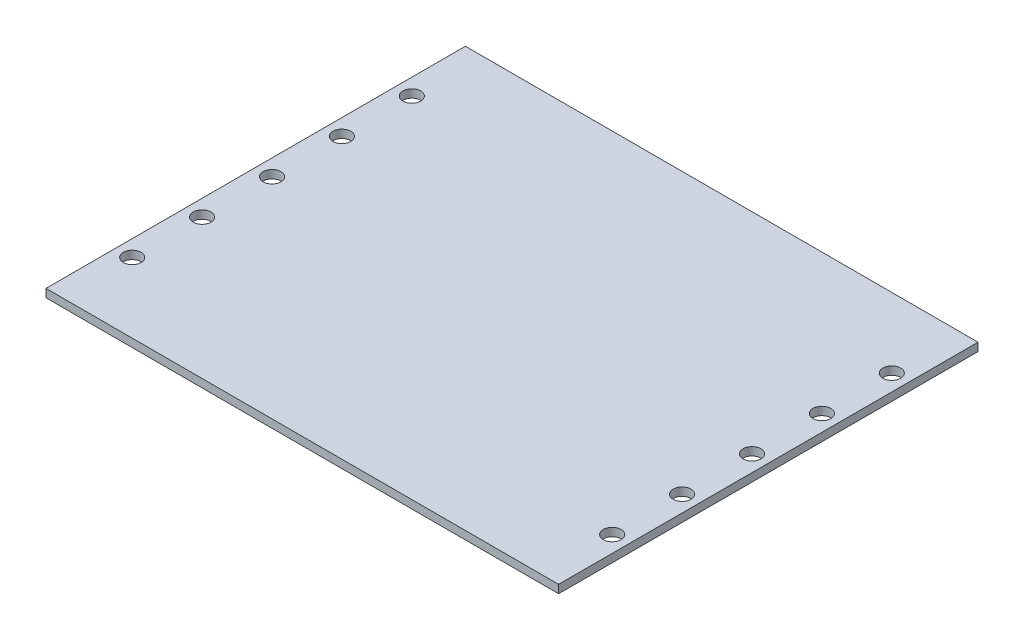
ISO-10303-21;
HEADER;
FILE_DESCRIPTION(('STEP AP214'),'2;1');
FILE_NAME('part.step','',(''),(''),'','','');
FILE_SCHEMA(('AUTOMOTIVE_DESIGN { 1 0 10303 214 1 1 1 1 }'));
ENDSEC;
DATA;
#1=APPLICATION_CONTEXT('core data for automotive mechanical design processes');
#2=APPLICATION_PROTOCOL_DEFINITION('international standard','automotive_design',2000,#1);
#3=PRODUCT_CONTEXT('',#1,'mechanical');
#4=PRODUCT('Part','Part','',(#3));
#5=PRODUCT_RELATED_PRODUCT_CATEGORY('part','',(#4));
#6=PRODUCT_DEFINITION_FORMATION('','',#4);
#7=PRODUCT_DEFINITION_CONTEXT('part definition',#1,'design');
#8=PRODUCT_DEFINITION('design','',#6,#7);
#9=PRODUCT_DEFINITION_SHAPE('','',#8);
#10=(LENGTH_UNIT() NAMED_UNIT(*) SI_UNIT(.MILLI.,.METRE.));
#11=(NAMED_UNIT(*) PLANE_ANGLE_UNIT() SI_UNIT($,.RADIAN.));
#12=(NAMED_UNIT(*) SI_UNIT($,.STERADIAN.) SOLID_ANGLE_UNIT());
#13=UNCERTAINTY_MEASURE_WITH_UNIT(LENGTH_MEASURE(1.E-05),#10,'distance_accuracy_value','');
#14=(GEOMETRIC_REPRESENTATION_CONTEXT(3) GLOBAL_UNCERTAINTY_ASSIGNED_CONTEXT((#13)) GLOBAL_UNIT_ASSIGNED_CONTEXT((#10,
#11,#12)) REPRESENTATION_CONTEXT('',''));
#15=CARTESIAN_POINT('',(0.,0.,0.));
#16=DIRECTION('',(0.,0.,1.));
#17=DIRECTION('',(1.,0.,0.));
#18=AXIS2_PLACEMENT_3D('',#15,#16,#17);
#19=CARTESIAN_POINT('',(0.,1.7526,-90.));
#20=DIRECTION('',(1.,0.,0.));
#21=DIRECTION('',(0.,0.,-1.));
#22=AXIS2_PLACEMENT_3D('',#19,#20,#21);
#23=PLANE('',#22);
#24=DIRECTION('',(0.,0.,1.));
#25=VECTOR('',#24,1.);
#26=CARTESIAN_POINT('',(0.,0.,-90.));
#27=LINE('',#26,#25);
#28=CARTESIAN_POINT('',(0.,0.,-90.));
#29=VERTEX_POINT('',#28);
#30=CARTESIAN_POINT('',(0.,0.,0.));
#31=VERTEX_POINT('',#30);
#32=EDGE_CURVE('E98',#29,#31,#27,.T.);
#33=ORIENTED_EDGE('',*,*,#32,.T.);
#34=DIRECTION('',(0.,-1.,0.));
#35=VECTOR('',#34,1.);
#36=CARTESIAN_POINT('',(0.,1.7526,0.));
#37=LINE('',#36,#35);
#38=CARTESIAN_POINT('',(0.,1.7526,0.));
#39=VERTEX_POINT('',#38);
#40=EDGE_CURVE('E11',#39,#31,#37,.T.);
#41=ORIENTED_EDGE('',*,*,#40,.F.);
#42=DIRECTION('',(0.,0.,1.));
#43=VECTOR('',#42,1.);
#44=CARTESIAN_POINT('',(0.,1.7526,-90.));
#45=LINE('',#44,#43);
#46=CARTESIAN_POINT('',(0.,1.7526,-90.));
#47=VERTEX_POINT('',#46);
#48=EDGE_CURVE('E86',#47,#39,#45,.T.);
#49=ORIENTED_EDGE('',*,*,#48,.F.);
#50=DIRECTION('',(0.,-1.,0.));
#51=VECTOR('',#50,1.);
#52=CARTESIAN_POINT('',(0.,1.7526,-90.));
#53=LINE('',#52,#51);
#54=EDGE_CURVE('E94',#47,#29,#53,.T.);
#55=ORIENTED_EDGE('',*,*,#54,.T.);
#56=EDGE_LOOP('',(#33,#41,#49,#55));
#57=FACE_BOUND('',#56,.T.);
#58=ADVANCED_FACE('F35',(#57),#23,.F.);
#59=CARTESIAN_POINT('',(0.,1.7526,0.));
#60=DIRECTION('',(0.,0.,-1.));
#61=DIRECTION('',(-1.,0.,0.));
#62=AXIS2_PLACEMENT_3D('',#59,#60,#61);
#63=PLANE('',#62);
#64=DIRECTION('',(1.,0.,0.));
#65=VECTOR('',#64,1.);
#66=CARTESIAN_POINT('',(0.,0.,0.));
#67=LINE('',#66,#65);
#68=CARTESIAN_POINT('',(110.,0.,0.));
#69=VERTEX_POINT('',#68);
#70=EDGE_CURVE('E90',#31,#69,#67,.T.);
#71=ORIENTED_EDGE('',*,*,#70,.T.);
#72=DIRECTION('',(0.,-1.,0.));
#73=VECTOR('',#72,1.);
#74=CARTESIAN_POINT('',(110.,1.7526,0.));
#75=LINE('',#74,#73);
#76=CARTESIAN_POINT('',(110.,1.7526,0.));
#77=VERTEX_POINT('',#76);
#78=EDGE_CURVE('E43',#77,#69,#75,.T.);
#79=ORIENTED_EDGE('',*,*,#78,.F.);
#80=DIRECTION('',(1.,0.,0.));
#81=VECTOR('',#80,1.);
#82=CARTESIAN_POINT('',(0.,1.7526,0.));
#83=LINE('',#82,#81);
#84=EDGE_CURVE('E81',#39,#77,#83,.T.);
#85=ORIENTED_EDGE('',*,*,#84,.F.);
#86=ORIENTED_EDGE('',*,*,#40,.T.);
#87=EDGE_LOOP('',(#71,#79,#85,#86));
#88=FACE_BOUND('',#87,.T.);
#89=ADVANCED_FACE('F89',(#88),#63,.F.);
#90=CARTESIAN_POINT('',(110.,1.7526,0.));
#91=DIRECTION('',(-1.,0.,0.));
#92=DIRECTION('',(0.,0.,1.));
#93=AXIS2_PLACEMENT_3D('',#90,#91,#92);
#94=PLANE('',#93);
#95=DIRECTION('',(0.,0.,-1.));
#96=VECTOR('',#95,1.);
#97=CARTESIAN_POINT('',(110.,0.,0.));
#98=LINE('',#97,#96);
#99=CARTESIAN_POINT('',(110.,0.,-90.));
#100=VERTEX_POINT('',#99);
#101=EDGE_CURVE('E68',#69,#100,#98,.T.);
#102=ORIENTED_EDGE('',*,*,#101,.T.);
#103=DIRECTION('',(0.,-1.,0.));
#104=VECTOR('',#103,1.);
#105=CARTESIAN_POINT('',(110.,1.7526,-90.));
#106=LINE('',#105,#104);
#107=CARTESIAN_POINT('',(110.,1.7526,-90.));
#108=VERTEX_POINT('',#107);
#109=EDGE_CURVE('E91',#108,#100,#106,.T.);
#110=ORIENTED_EDGE('',*,*,#109,.F.);
#111=DIRECTION('',(0.,0.,-1.));
#112=VECTOR('',#111,1.);
#113=CARTESIAN_POINT('',(110.,1.7526,0.));
#114=LINE('',#113,#112);
#115=EDGE_CURVE('E84',#77,#108,#114,.T.);
#116=ORIENTED_EDGE('',*,*,#115,.F.);
#117=ORIENTED_EDGE('',*,*,#78,.T.);
#118=EDGE_LOOP('',(#102,#110,#116,#117));
#119=FACE_BOUND('',#118,.T.);
#120=ADVANCED_FACE('F92',(#119),#94,.F.);
#121=CARTESIAN_POINT('',(110.,1.7526,-90.));
#122=DIRECTION('',(0.,0.,1.));
#123=DIRECTION('',(1.,0.,0.));
#124=AXIS2_PLACEMENT_3D('',#121,#122,#123);
#125=PLANE('',#124);
#126=DIRECTION('',(-1.,0.,0.));
#127=VECTOR('',#126,1.);
#128=CARTESIAN_POINT('',(110.,0.,-90.));
#129=LINE('',#128,#127);
#130=EDGE_CURVE('E74',#100,#29,#129,.T.);
#131=ORIENTED_EDGE('',*,*,#130,.T.);
#132=ORIENTED_EDGE('',*,*,#54,.F.);
#133=DIRECTION('',(-1.,0.,0.));
#134=VECTOR('',#133,1.);
#135=CARTESIAN_POINT('',(110.,1.7526,-90.));
#136=LINE('',#135,#134);
#137=EDGE_CURVE('E51',#108,#47,#136,.T.);
#138=ORIENTED_EDGE('',*,*,#137,.F.);
#139=ORIENTED_EDGE('',*,*,#109,.T.);
#140=EDGE_LOOP('',(#131,#132,#138,#139));
#141=FACE_BOUND('',#140,.T.);
#142=ADVANCED_FACE('F106',(#141),#125,.F.);
#143=CARTESIAN_POINT('',(0.,1.7526,0.));
#144=DIRECTION('',(0.,1.,0.));
#145=DIRECTION('',(0.,0.,1.));
#146=AXIS2_PLACEMENT_3D('',#143,#144,#145);
#147=PLANE('',#146);
#148=CARTESIAN_POINT('',(3.49999999999979,1.7526,-75.));
#149=DIRECTION('',(0.,1.,0.));
#150=DIRECTION('',(0.,0.,1.));
#151=AXIS2_PLACEMENT_3D('',#148,#149,#150);
#152=CIRCLE('',#151,1.905);
#153=CARTESIAN_POINT('',(3.49999999999979,1.7526,-73.095));
#154=VERTEX_POINT('',#153);
#155=EDGE_CURVE('E166',#154,#154,#152,.T.);
#156=ORIENTED_EDGE('',*,*,#155,.F.);
#157=EDGE_LOOP('',(#156));
#158=FACE_BOUND('',#157,.T.);
#159=CARTESIAN_POINT('',(3.49999999999984,1.7526,-60.));
#160=DIRECTION('',(0.,1.,0.));
#161=DIRECTION('',(0.,0.,1.));
#162=AXIS2_PLACEMENT_3D('',#159,#160,#161);
#163=CIRCLE('',#162,1.905);
#164=CARTESIAN_POINT('',(3.49999999999984,1.7526,-58.095));
#165=VERTEX_POINT('',#164);
#166=EDGE_CURVE('E160',#165,#165,#163,.T.);
#167=ORIENTED_EDGE('',*,*,#166,.F.);
#168=EDGE_LOOP('',(#167));
#169=FACE_BOUND('',#168,.T.);
#170=CARTESIAN_POINT('',(3.4999999999999,1.7526,-45.));
#171=DIRECTION('',(0.,1.,0.));
#172=DIRECTION('',(0.,0.,1.));
#173=AXIS2_PLACEMENT_3D('',#170,#171,#172);
#174=CIRCLE('',#173,1.905);
#175=CARTESIAN_POINT('',(3.4999999999999,1.7526,-43.095));
#176=VERTEX_POINT('',#175);
#177=EDGE_CURVE('E154',#176,#176,#174,.T.);
#178=ORIENTED_EDGE('',*,*,#177,.F.);
#179=EDGE_LOOP('',(#178));
#180=FACE_BOUND('',#179,.T.);
#181=CARTESIAN_POINT('',(3.49999999999995,1.7526,-30.));
#182=DIRECTION('',(0.,1.,0.));
#183=DIRECTION('',(0.,0.,1.));
#184=AXIS2_PLACEMENT_3D('',#181,#182,#183);
#185=CIRCLE('',#184,1.905);
#186=CARTESIAN_POINT('',(3.49999999999995,1.7526,-28.095));
#187=VERTEX_POINT('',#186);
#188=EDGE_CURVE('E148',#187,#187,#185,.T.);
#189=ORIENTED_EDGE('',*,*,#188,.F.);
#190=EDGE_LOOP('',(#189));
#191=FACE_BOUND('',#190,.T.);
#192=CARTESIAN_POINT('',(106.5,1.7526,-75.));
#193=DIRECTION('',(0.,1.,0.));
#194=DIRECTION('',(0.,0.,1.));
#195=AXIS2_PLACEMENT_3D('',#192,#193,#194);
#196=CIRCLE('',#195,1.905);
#197=CARTESIAN_POINT('',(106.5,1.7526,-73.095));
#198=VERTEX_POINT('',#197);
#199=EDGE_CURVE('E142',#198,#198,#196,.T.);
#200=ORIENTED_EDGE('',*,*,#199,.F.);
#201=EDGE_LOOP('',(#200));
#202=FACE_BOUND('',#201,.T.);
#203=CARTESIAN_POINT('',(106.5,1.7526,-60.));
#204=DIRECTION('',(0.,1.,0.));
#205=DIRECTION('',(0.,0.,1.));
#206=AXIS2_PLACEMENT_3D('',#203,#204,#205);
#207=CIRCLE('',#206,1.90499999999999);
#208=CARTESIAN_POINT('',(106.5,1.7526,-58.095));
#209=VERTEX_POINT('',#208);
#210=EDGE_CURVE('E136',#209,#209,#207,.T.);
#211=ORIENTED_EDGE('',*,*,#210,.F.);
#212=EDGE_LOOP('',(#211));
#213=FACE_BOUND('',#212,.T.);
#214=CARTESIAN_POINT('',(106.5,1.7526,-45.));
#215=DIRECTION('',(0.,1.,0.));
#216=DIRECTION('',(0.,0.,1.));
#217=AXIS2_PLACEMENT_3D('',#214,#215,#216);
#218=CIRCLE('',#217,1.90499999999999);
#219=CARTESIAN_POINT('',(106.5,1.7526,-43.095));
#220=VERTEX_POINT('',#219);
#221=EDGE_CURVE('E130',#220,#220,#218,.T.);
#222=ORIENTED_EDGE('',*,*,#221,.F.);
#223=EDGE_LOOP('',(#222));
#224=FACE_BOUND('',#223,.T.);
#225=CARTESIAN_POINT('',(106.5,1.7526,-30.));
#226=DIRECTION('',(0.,1.,0.));
#227=DIRECTION('',(0.,0.,1.));
#228=AXIS2_PLACEMENT_3D('',#225,#226,#227);
#229=CIRCLE('',#228,1.90499999999999);
#230=CARTESIAN_POINT('',(106.5,1.7526,-28.095));
#231=VERTEX_POINT('',#230);
#232=EDGE_CURVE('E124',#231,#231,#229,.T.);
#233=ORIENTED_EDGE('',*,*,#232,.F.);
#234=EDGE_LOOP('',(#233));
#235=FACE_BOUND('',#234,.T.);
#236=CARTESIAN_POINT('',(106.5,1.7526,-15.));
#237=DIRECTION('',(0.,1.,0.));
#238=DIRECTION('',(0.,0.,1.));
#239=AXIS2_PLACEMENT_3D('',#236,#237,#238);
#240=CIRCLE('',#239,1.90499999999999);
#241=CARTESIAN_POINT('',(106.5,1.7526,-13.095));
#242=VERTEX_POINT('',#241);
#243=EDGE_CURVE('E118',#242,#242,#240,.T.);
#244=ORIENTED_EDGE('',*,*,#243,.F.);
#245=EDGE_LOOP('',(#244));
#246=FACE_BOUND('',#245,.T.);
#247=CARTESIAN_POINT('',(3.5,1.7526,-15.));
#248=DIRECTION('',(0.,1.,0.));
#249=DIRECTION('',(0.,0.,1.));
#250=AXIS2_PLACEMENT_3D('',#247,#248,#249);
#251=CIRCLE('',#250,1.905);
#252=CARTESIAN_POINT('',(3.5,1.7526,-13.095));
#253=VERTEX_POINT('',#252);
#254=EDGE_CURVE('E112',#253,#253,#251,.T.);
#255=ORIENTED_EDGE('',*,*,#254,.F.);
#256=EDGE_LOOP('',(#255));
#257=FACE_BOUND('',#256,.T.);
#258=ORIENTED_EDGE('',*,*,#48,.T.);
#259=ORIENTED_EDGE('',*,*,#84,.T.);
#260=ORIENTED_EDGE('',*,*,#115,.T.);
#261=ORIENTED_EDGE('',*,*,#137,.T.);
#262=EDGE_LOOP('',(#258,#259,#260,#261));
#263=FACE_BOUND('',#262,.T.);
#264=ADVANCED_FACE('F82',(#158,#169,#180,#191,#202,#213,#224,#235,#246,#257,#263),#147,.T.);
#265=CARTESIAN_POINT('',(0.,0.,0.));
#266=DIRECTION('',(0.,1.,0.));
#267=DIRECTION('',(0.,0.,1.));
#268=AXIS2_PLACEMENT_3D('',#265,#266,#267);
#269=PLANE('',#268);
#270=CARTESIAN_POINT('',(3.49999999999979,0.,-75.));
#271=DIRECTION('',(0.,1.,0.));
#272=DIRECTION('',(0.,0.,1.));
#273=AXIS2_PLACEMENT_3D('',#270,#271,#272);
#274=CIRCLE('',#273,1.905);
#275=CARTESIAN_POINT('',(3.49999999999979,0.,-73.095));
#276=VERTEX_POINT('',#275);
#277=EDGE_CURVE('E163',#276,#276,#274,.T.);
#278=ORIENTED_EDGE('',*,*,#277,.T.);
#279=EDGE_LOOP('',(#278));
#280=FACE_BOUND('',#279,.T.);
#281=CARTESIAN_POINT('',(3.49999999999984,0.,-60.));
#282=DIRECTION('',(0.,1.,0.));
#283=DIRECTION('',(0.,0.,1.));
#284=AXIS2_PLACEMENT_3D('',#281,#282,#283);
#285=CIRCLE('',#284,1.905);
#286=CARTESIAN_POINT('',(3.49999999999984,0.,-58.095));
#287=VERTEX_POINT('',#286);
#288=EDGE_CURVE('E157',#287,#287,#285,.T.);
#289=ORIENTED_EDGE('',*,*,#288,.T.);
#290=EDGE_LOOP('',(#289));
#291=FACE_BOUND('',#290,.T.);
#292=CARTESIAN_POINT('',(3.4999999999999,0.,-45.));
#293=DIRECTION('',(0.,1.,0.));
#294=DIRECTION('',(0.,0.,1.));
#295=AXIS2_PLACEMENT_3D('',#292,#293,#294);
#296=CIRCLE('',#295,1.905);
#297=CARTESIAN_POINT('',(3.4999999999999,0.,-43.095));
#298=VERTEX_POINT('',#297);
#299=EDGE_CURVE('E151',#298,#298,#296,.T.);
#300=ORIENTED_EDGE('',*,*,#299,.T.);
#301=EDGE_LOOP('',(#300));
#302=FACE_BOUND('',#301,.T.);
#303=CARTESIAN_POINT('',(3.49999999999995,0.,-30.));
#304=DIRECTION('',(0.,1.,0.));
#305=DIRECTION('',(0.,0.,1.));
#306=AXIS2_PLACEMENT_3D('',#303,#304,#305);
#307=CIRCLE('',#306,1.905);
#308=CARTESIAN_POINT('',(3.49999999999995,0.,-28.095));
#309=VERTEX_POINT('',#308);
#310=EDGE_CURVE('E145',#309,#309,#307,.T.);
#311=ORIENTED_EDGE('',*,*,#310,.T.);
#312=EDGE_LOOP('',(#311));
#313=FACE_BOUND('',#312,.T.);
#314=CARTESIAN_POINT('',(106.5,0.,-75.));
#315=DIRECTION('',(0.,1.,0.));
#316=DIRECTION('',(0.,0.,1.));
#317=AXIS2_PLACEMENT_3D('',#314,#315,#316);
#318=CIRCLE('',#317,1.905);
#319=CARTESIAN_POINT('',(106.5,0.,-73.095));
#320=VERTEX_POINT('',#319);
#321=EDGE_CURVE('E139',#320,#320,#318,.T.);
#322=ORIENTED_EDGE('',*,*,#321,.T.);
#323=EDGE_LOOP('',(#322));
#324=FACE_BOUND('',#323,.T.);
#325=CARTESIAN_POINT('',(106.5,0.,-60.));
#326=DIRECTION('',(0.,1.,0.));
#327=DIRECTION('',(0.,0.,1.));
#328=AXIS2_PLACEMENT_3D('',#325,#326,#327);
#329=CIRCLE('',#328,1.90499999999999);
#330=CARTESIAN_POINT('',(106.5,0.,-58.095));
#331=VERTEX_POINT('',#330);
#332=EDGE_CURVE('E133',#331,#331,#329,.T.);
#333=ORIENTED_EDGE('',*,*,#332,.T.);
#334=EDGE_LOOP('',(#333));
#335=FACE_BOUND('',#334,.T.);
#336=CARTESIAN_POINT('',(106.5,0.,-45.));
#337=DIRECTION('',(0.,1.,0.));
#338=DIRECTION('',(0.,0.,1.));
#339=AXIS2_PLACEMENT_3D('',#336,#337,#338);
#340=CIRCLE('',#339,1.90499999999999);
#341=CARTESIAN_POINT('',(106.5,0.,-43.095));
#342=VERTEX_POINT('',#341);
#343=EDGE_CURVE('E127',#342,#342,#340,.T.);
#344=ORIENTED_EDGE('',*,*,#343,.T.);
#345=EDGE_LOOP('',(#344));
#346=FACE_BOUND('',#345,.T.);
#347=CARTESIAN_POINT('',(106.5,0.,-30.));
#348=DIRECTION('',(0.,1.,0.));
#349=DIRECTION('',(0.,0.,1.));
#350=AXIS2_PLACEMENT_3D('',#347,#348,#349);
#351=CIRCLE('',#350,1.90499999999999);
#352=CARTESIAN_POINT('',(106.5,0.,-28.095));
#353=VERTEX_POINT('',#352);
#354=EDGE_CURVE('E121',#353,#353,#351,.T.);
#355=ORIENTED_EDGE('',*,*,#354,.T.);
#356=EDGE_LOOP('',(#355));
#357=FACE_BOUND('',#356,.T.);
#358=CARTESIAN_POINT('',(106.5,0.,-15.));
#359=DIRECTION('',(0.,1.,0.));
#360=DIRECTION('',(0.,0.,1.));
#361=AXIS2_PLACEMENT_3D('',#358,#359,#360);
#362=CIRCLE('',#361,1.90499999999999);
#363=CARTESIAN_POINT('',(106.5,0.,-13.095));
#364=VERTEX_POINT('',#363);
#365=EDGE_CURVE('E115',#364,#364,#362,.T.);
#366=ORIENTED_EDGE('',*,*,#365,.T.);
#367=EDGE_LOOP('',(#366));
#368=FACE_BOUND('',#367,.T.);
#369=CARTESIAN_POINT('',(3.5,0.,-15.));
#370=DIRECTION('',(0.,1.,0.));
#371=DIRECTION('',(0.,0.,1.));
#372=AXIS2_PLACEMENT_3D('',#369,#370,#371);
#373=CIRCLE('',#372,1.905);
#374=CARTESIAN_POINT('',(3.5,0.,-13.095));
#375=VERTEX_POINT('',#374);
#376=EDGE_CURVE('E101',#375,#375,#373,.T.);
#377=ORIENTED_EDGE('',*,*,#376,.T.);
#378=EDGE_LOOP('',(#377));
#379=FACE_BOUND('',#378,.T.);
#380=ORIENTED_EDGE('',*,*,#32,.F.);
#381=ORIENTED_EDGE('',*,*,#130,.F.);
#382=ORIENTED_EDGE('',*,*,#101,.F.);
#383=ORIENTED_EDGE('',*,*,#70,.F.);
#384=EDGE_LOOP('',(#380,#381,#382,#383));
#385=FACE_BOUND('',#384,.T.);
#386=ADVANCED_FACE('F109',(#280,#291,#302,#313,#324,#335,#346,#357,#368,#379,#385),#269,.F.);
#387=CARTESIAN_POINT('',(3.5,0.,-15.));
#388=DIRECTION('',(0.,1.,0.));
#389=DIRECTION('',(0.,0.,1.));
#390=AXIS2_PLACEMENT_3D('',#387,#388,#389);
#391=CYLINDRICAL_SURFACE('',#390,1.905);
#392=ORIENTED_EDGE('',*,*,#376,.F.);
#393=EDGE_LOOP('',(#392));
#394=FACE_BOUND('',#393,.T.);
#395=ORIENTED_EDGE('',*,*,#254,.T.);
#396=EDGE_LOOP('',(#395));
#397=FACE_BOUND('',#396,.T.);
#398=ADVANCED_FACE('F202',(#394,#397),#391,.F.);
#399=CARTESIAN_POINT('',(106.5,0.,-15.));
#400=DIRECTION('',(0.,1.,0.));
#401=DIRECTION('',(0.,0.,1.));
#402=AXIS2_PLACEMENT_3D('',#399,#400,#401);
#403=CYLINDRICAL_SURFACE('',#402,1.90499999999999);
#404=ORIENTED_EDGE('',*,*,#365,.F.);
#405=EDGE_LOOP('',(#404));
#406=FACE_BOUND('',#405,.T.);
#407=ORIENTED_EDGE('',*,*,#243,.T.);
#408=EDGE_LOOP('',(#407));
#409=FACE_BOUND('',#408,.T.);
#410=ADVANCED_FACE('F204',(#406,#409),#403,.F.);
#411=CARTESIAN_POINT('',(106.5,0.,-30.));
#412=DIRECTION('',(0.,1.,0.));
#413=DIRECTION('',(0.,0.,1.));
#414=AXIS2_PLACEMENT_3D('',#411,#412,#413);
#415=CYLINDRICAL_SURFACE('',#414,1.90499999999999);
#416=ORIENTED_EDGE('',*,*,#354,.F.);
#417=EDGE_LOOP('',(#416));
#418=FACE_BOUND('',#417,.T.);
#419=ORIENTED_EDGE('',*,*,#232,.T.);
#420=EDGE_LOOP('',(#419));
#421=FACE_BOUND('',#420,.T.);
#422=ADVANCED_FACE('F211',(#418,#421),#415,.F.);
#423=CARTESIAN_POINT('',(106.5,0.,-45.));
#424=DIRECTION('',(0.,1.,0.));
#425=DIRECTION('',(0.,0.,1.));
#426=AXIS2_PLACEMENT_3D('',#423,#424,#425);
#427=CYLINDRICAL_SURFACE('',#426,1.90499999999999);
#428=ORIENTED_EDGE('',*,*,#343,.F.);
#429=EDGE_LOOP('',(#428));
#430=FACE_BOUND('',#429,.T.);
#431=ORIENTED_EDGE('',*,*,#221,.T.);
#432=EDGE_LOOP('',(#431));
#433=FACE_BOUND('',#432,.T.);
#434=ADVANCED_FACE('F258',(#430,#433),#427,.F.);
#435=CARTESIAN_POINT('',(106.5,0.,-60.));
#436=DIRECTION('',(0.,1.,0.));
#437=DIRECTION('',(0.,0.,1.));
#438=AXIS2_PLACEMENT_3D('',#435,#436,#437);
#439=CYLINDRICAL_SURFACE('',#438,1.90499999999999);
#440=ORIENTED_EDGE('',*,*,#332,.F.);
#441=EDGE_LOOP('',(#440));
#442=FACE_BOUND('',#441,.T.);
#443=ORIENTED_EDGE('',*,*,#210,.T.);
#444=EDGE_LOOP('',(#443));
#445=FACE_BOUND('',#444,.T.);
#446=ADVANCED_FACE('F268',(#442,#445),#439,.F.);
#447=CARTESIAN_POINT('',(106.5,0.,-75.));
#448=DIRECTION('',(0.,1.,0.));
#449=DIRECTION('',(0.,0.,1.));
#450=AXIS2_PLACEMENT_3D('',#447,#448,#449);
#451=CYLINDRICAL_SURFACE('',#450,1.905);
#452=ORIENTED_EDGE('',*,*,#321,.F.);
#453=EDGE_LOOP('',(#452));
#454=FACE_BOUND('',#453,.T.);
#455=ORIENTED_EDGE('',*,*,#199,.T.);
#456=EDGE_LOOP('',(#455));
#457=FACE_BOUND('',#456,.T.);
#458=ADVANCED_FACE('F278',(#454,#457),#451,.F.);
#459=CARTESIAN_POINT('',(3.49999999999995,0.,-30.));
#460=DIRECTION('',(0.,1.,0.));
#461=DIRECTION('',(0.,0.,1.));
#462=AXIS2_PLACEMENT_3D('',#459,#460,#461);
#463=CYLINDRICAL_SURFACE('',#462,1.905);
#464=ORIENTED_EDGE('',*,*,#310,.F.);
#465=EDGE_LOOP('',(#464));
#466=FACE_BOUND('',#465,.T.);
#467=ORIENTED_EDGE('',*,*,#188,.T.);
#468=EDGE_LOOP('',(#467));
#469=FACE_BOUND('',#468,.T.);
#470=ADVANCED_FACE('F288',(#466,#469),#463,.F.);
#471=CARTESIAN_POINT('',(3.4999999999999,0.,-45.));
#472=DIRECTION('',(0.,1.,0.));
#473=DIRECTION('',(0.,0.,1.));
#474=AXIS2_PLACEMENT_3D('',#471,#472,#473);
#475=CYLINDRICAL_SURFACE('',#474,1.905);
#476=ORIENTED_EDGE('',*,*,#299,.F.);
#477=EDGE_LOOP('',(#476));
#478=FACE_BOUND('',#477,.T.);
#479=ORIENTED_EDGE('',*,*,#177,.T.);
#480=EDGE_LOOP('',(#479));
#481=FACE_BOUND('',#480,.T.);
#482=ADVANCED_FACE('F298',(#478,#481),#475,.F.);
#483=CARTESIAN_POINT('',(3.49999999999984,0.,-60.));
#484=DIRECTION('',(0.,1.,0.));
#485=DIRECTION('',(0.,0.,1.));
#486=AXIS2_PLACEMENT_3D('',#483,#484,#485);
#487=CYLINDRICAL_SURFACE('',#486,1.905);
#488=ORIENTED_EDGE('',*,*,#288,.F.);
#489=EDGE_LOOP('',(#488));
#490=FACE_BOUND('',#489,.T.);
#491=ORIENTED_EDGE('',*,*,#166,.T.);
#492=EDGE_LOOP('',(#491));
#493=FACE_BOUND('',#492,.T.);
#494=ADVANCED_FACE('F177',(#490,#493),#487,.F.);
#495=CARTESIAN_POINT('',(3.49999999999979,0.,-75.));
#496=DIRECTION('',(0.,1.,0.));
#497=DIRECTION('',(0.,0.,1.));
#498=AXIS2_PLACEMENT_3D('',#495,#496,#497);
#499=CYLINDRICAL_SURFACE('',#498,1.905);
#500=ORIENTED_EDGE('',*,*,#277,.F.);
#501=EDGE_LOOP('',(#500));
#502=FACE_BOUND('',#501,.T.);
#503=ORIENTED_EDGE('',*,*,#155,.T.);
#504=EDGE_LOOP('',(#503));
#505=FACE_BOUND('',#504,.T.);
#506=ADVANCED_FACE('F174',(#502,#505),#499,.F.);
#507=CLOSED_SHELL('',(#58,#89,#120,#142,#264,#386,#398,#410,#422,#434,#446,#458,#470,#482,#494,#506));
#508=MANIFOLD_SOLID_BREP('B2',#507);
#509=ADVANCED_BREP_SHAPE_REPRESENTATION('',(#18,#508),#14);
#510=SHAPE_DEFINITION_REPRESENTATION(#9,#509);
ENDSEC;
END-ISO-10303-21;
